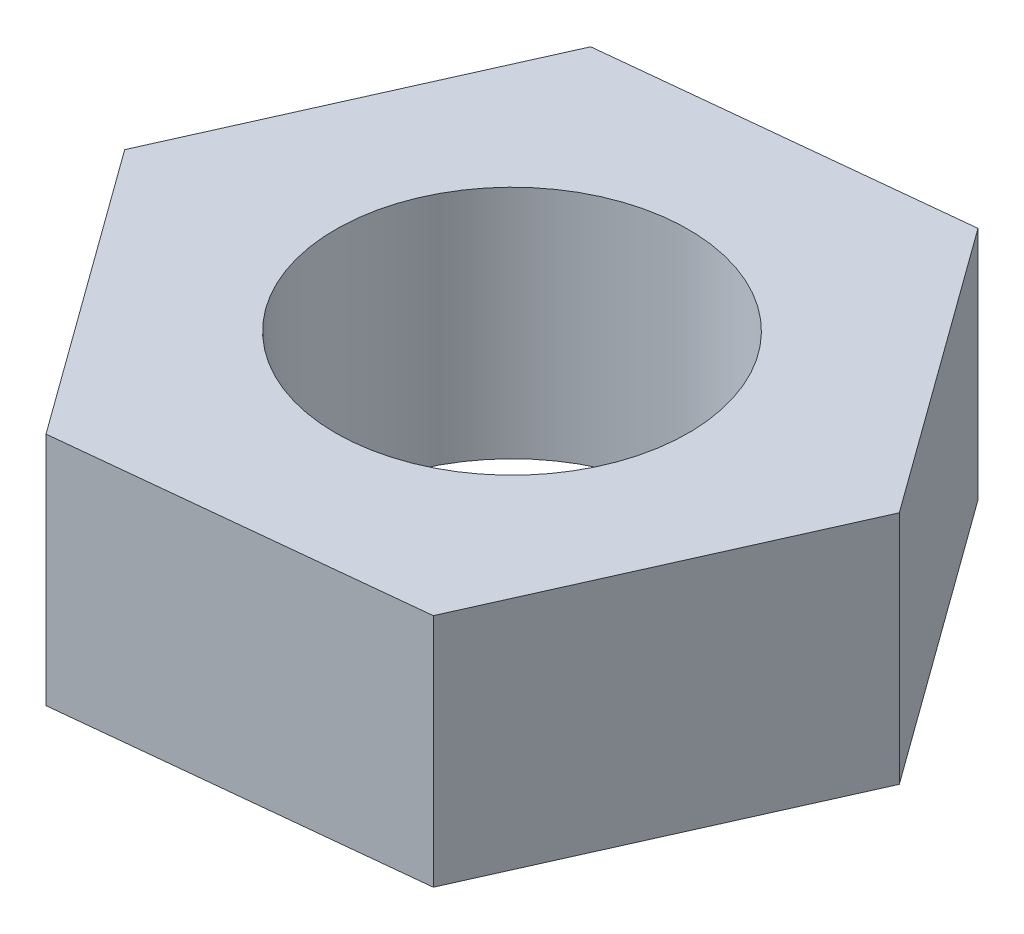
ISO-10303-21;
HEADER;
FILE_DESCRIPTION(('STEP AP214'),'2;1');
FILE_NAME('part.step','',(''),(''),'','','');
FILE_SCHEMA(('AUTOMOTIVE_DESIGN { 1 0 10303 214 1 1 1 1 }'));
ENDSEC;
DATA;
#1=APPLICATION_CONTEXT('core data for automotive mechanical design processes');
#2=APPLICATION_PROTOCOL_DEFINITION('international standard','automotive_design',2000,#1);
#3=PRODUCT_CONTEXT('',#1,'mechanical');
#4=PRODUCT('Part','Part','',(#3));
#5=PRODUCT_RELATED_PRODUCT_CATEGORY('part','',(#4));
#6=PRODUCT_DEFINITION_FORMATION('','',#4);
#7=PRODUCT_DEFINITION_CONTEXT('part definition',#1,'design');
#8=PRODUCT_DEFINITION('design','',#6,#7);
#9=PRODUCT_DEFINITION_SHAPE('','',#8);
#10=(LENGTH_UNIT() NAMED_UNIT(*) SI_UNIT(.MILLI.,.METRE.));
#11=(NAMED_UNIT(*) PLANE_ANGLE_UNIT() SI_UNIT($,.RADIAN.));
#12=(NAMED_UNIT(*) SI_UNIT($,.STERADIAN.) SOLID_ANGLE_UNIT());
#13=UNCERTAINTY_MEASURE_WITH_UNIT(LENGTH_MEASURE(1.E-05),#10,'distance_accuracy_value','');
#14=(GEOMETRIC_REPRESENTATION_CONTEXT(3) GLOBAL_UNCERTAINTY_ASSIGNED_CONTEXT((#13)) GLOBAL_UNIT_ASSIGNED_CONTEXT((#10,
#11,#12)) REPRESENTATION_CONTEXT('',''));
#15=CARTESIAN_POINT('',(0.,0.,0.));
#16=DIRECTION('',(0.,0.,1.));
#17=DIRECTION('',(1.,0.,0.));
#18=AXIS2_PLACEMENT_3D('',#15,#16,#17);
#19=CARTESIAN_POINT('',(-5.39156409330923,2.,-4.14920426860483));
#20=DIRECTION('',(0.,1.,0.));
#21=DIRECTION('',(0.,0.,1.));
#22=AXIS2_PLACEMENT_3D('',#19,#20,#21);
#23=PLANE('',#22);
#24=DIRECTION('',(-0.586718706174764,0.,-0.809790812385897));
#25=VECTOR('',#24,1.);
#26=CARTESIAN_POINT('',(-3.63140797478494,2.,-1.71983183144714));
#27=LINE('',#26,#25);
#28=CARTESIAN_POINT('',(-3.63140797478494,2.,-1.71983183144714));
#29=VERTEX_POINT('',#28);
#30=CARTESIAN_POINT('',(-5.39156409330923,2.,-4.14920426860483));
#31=VERTEX_POINT('',#30);
#32=EDGE_CURVE('E127',#29,#31,#27,.T.);
#33=ORIENTED_EDGE('',*,*,#32,.T.);
#34=DIRECTION('',(-0.994658768364807,0.,0.103217898229934));
#35=VECTOR('',#34,1.);
#36=CARTESIAN_POINT('',(-5.39156409330923,2.,-4.14920426860483));
#37=LINE('',#36,#35);
#38=CARTESIAN_POINT('',(-8.37554039840365,2.,-3.83955057391503));
#39=VERTEX_POINT('',#38);
#40=EDGE_CURVE('E85',#31,#39,#37,.T.);
#41=ORIENTED_EDGE('',*,*,#40,.T.);
#42=DIRECTION('',(-0.407940062190043,0.,0.913008710615832));
#43=VECTOR('',#42,1.);
#44=CARTESIAN_POINT('',(-8.37554039840365,2.,-3.83955057391503));
#45=LINE('',#44,#43);
#46=CARTESIAN_POINT('',(-9.59936058497378,2.,-1.10052444206754));
#47=VERTEX_POINT('',#46);
#48=EDGE_CURVE('E98',#39,#47,#45,.T.);
#49=ORIENTED_EDGE('',*,*,#48,.T.);
#50=DIRECTION('',(0.586718706174763,0.,0.809790812385898));
#51=VECTOR('',#50,1.);
#52=CARTESIAN_POINT('',(-9.59936058497378,2.,-1.10052444206754));
#53=LINE('',#52,#51);
#54=CARTESIAN_POINT('',(-7.83920446644949,2.,1.32884799509016));
#55=VERTEX_POINT('',#54);
#56=EDGE_CURVE('E92',#47,#55,#53,.T.);
#57=ORIENTED_EDGE('',*,*,#56,.T.);
#58=DIRECTION('',(0.994658768364807,0.,-0.103217898229934));
#59=VECTOR('',#58,1.);
#60=CARTESIAN_POINT('',(-7.83920446644949,2.,1.32884799509016));
#61=LINE('',#60,#59);
#62=CARTESIAN_POINT('',(-4.85522816135507,2.,1.01919430040036));
#63=VERTEX_POINT('',#62);
#64=EDGE_CURVE('E96',#55,#63,#61,.T.);
#65=ORIENTED_EDGE('',*,*,#64,.T.);
#66=DIRECTION('',(0.407940062190043,0.,-0.913008710615832));
#67=VECTOR('',#66,1.);
#68=CARTESIAN_POINT('',(-4.85522816135507,2.,1.01919430040036));
#69=LINE('',#68,#67);
#70=EDGE_CURVE('E48',#63,#29,#69,.T.);
#71=ORIENTED_EDGE('',*,*,#70,.T.);
#72=EDGE_LOOP('',(#33,#41,#49,#57,#65,#71));
#73=FACE_BOUND('',#72,.T.);
#74=CARTESIAN_POINT('',(-6.61538427987936,2.,-1.41017813675734));
#75=DIRECTION('',(0.,1.,0.));
#76=DIRECTION('',(0.,0.,1.));
#77=AXIS2_PLACEMENT_3D('',#74,#75,#76);
#78=CIRCLE('',#77,1.5);
#79=CARTESIAN_POINT('',(-6.61538427987936,2.,0.0898218632426591));
#80=VERTEX_POINT('',#79);
#81=EDGE_CURVE('E120',#80,#80,#78,.T.);
#82=ORIENTED_EDGE('',*,*,#81,.F.);
#83=EDGE_LOOP('',(#82));
#84=FACE_BOUND('',#83,.T.);
#85=ADVANCED_FACE('F31',(#73,#84),#23,.T.);
#86=CARTESIAN_POINT('',(-5.39156409330923,0.,-4.14920426860483));
#87=DIRECTION('',(0.,1.,0.));
#88=DIRECTION('',(0.,0.,1.));
#89=AXIS2_PLACEMENT_3D('',#86,#87,#88);
#90=PLANE('',#89);
#91=DIRECTION('',(-0.586718706174764,0.,-0.809790812385897));
#92=VECTOR('',#91,1.);
#93=CARTESIAN_POINT('',(-3.63140797478494,0.,-1.71983183144714));
#94=LINE('',#93,#92);
#95=CARTESIAN_POINT('',(-3.63140797478494,0.,-1.71983183144714));
#96=VERTEX_POINT('',#95);
#97=CARTESIAN_POINT('',(-5.39156409330923,0.,-4.14920426860483));
#98=VERTEX_POINT('',#97);
#99=EDGE_CURVE('E116',#96,#98,#94,.T.);
#100=ORIENTED_EDGE('',*,*,#99,.F.);
#101=DIRECTION('',(0.407940062190043,0.,-0.913008710615832));
#102=VECTOR('',#101,1.);
#103=CARTESIAN_POINT('',(-4.85522816135507,0.,1.01919430040036));
#104=LINE('',#103,#102);
#105=CARTESIAN_POINT('',(-4.85522816135507,0.,1.01919430040036));
#106=VERTEX_POINT('',#105);
#107=EDGE_CURVE('E77',#106,#96,#104,.T.);
#108=ORIENTED_EDGE('',*,*,#107,.F.);
#109=DIRECTION('',(0.994658768364807,0.,-0.103217898229934));
#110=VECTOR('',#109,1.);
#111=CARTESIAN_POINT('',(-7.83920446644949,0.,1.32884799509016));
#112=LINE('',#111,#110);
#113=CARTESIAN_POINT('',(-7.83920446644949,0.,1.32884799509016));
#114=VERTEX_POINT('',#113);
#115=EDGE_CURVE('E71',#114,#106,#112,.T.);
#116=ORIENTED_EDGE('',*,*,#115,.F.);
#117=DIRECTION('',(0.586718706174763,0.,0.809790812385898));
#118=VECTOR('',#117,1.);
#119=CARTESIAN_POINT('',(-9.59936058497378,0.,-1.10052444206754));
#120=LINE('',#119,#118);
#121=CARTESIAN_POINT('',(-9.59936058497378,0.,-1.10052444206754));
#122=VERTEX_POINT('',#121);
#123=EDGE_CURVE('E106',#122,#114,#120,.T.);
#124=ORIENTED_EDGE('',*,*,#123,.F.);
#125=DIRECTION('',(-0.407940062190043,0.,0.913008710615832));
#126=VECTOR('',#125,1.);
#127=CARTESIAN_POINT('',(-8.37554039840365,0.,-3.83955057391503));
#128=LINE('',#127,#126);
#129=CARTESIAN_POINT('',(-8.37554039840365,0.,-3.83955057391503));
#130=VERTEX_POINT('',#129);
#131=EDGE_CURVE('E122',#130,#122,#128,.T.);
#132=ORIENTED_EDGE('',*,*,#131,.F.);
#133=DIRECTION('',(-0.994658768364807,0.,0.103217898229934));
#134=VECTOR('',#133,1.);
#135=CARTESIAN_POINT('',(-5.39156409330923,0.,-4.14920426860483));
#136=LINE('',#135,#134);
#137=EDGE_CURVE('E119',#98,#130,#136,.T.);
#138=ORIENTED_EDGE('',*,*,#137,.F.);
#139=EDGE_LOOP('',(#100,#108,#116,#124,#132,#138));
#140=FACE_BOUND('',#139,.T.);
#141=CARTESIAN_POINT('',(-6.61538427987936,0.,-1.41017813675734));
#142=DIRECTION('',(0.,1.,0.));
#143=DIRECTION('',(0.,0.,1.));
#144=AXIS2_PLACEMENT_3D('',#141,#142,#143);
#145=CIRCLE('',#144,1.5);
#146=CARTESIAN_POINT('',(-6.61538427987936,0.,0.0898218632426591));
#147=VERTEX_POINT('',#146);
#148=EDGE_CURVE('E220',#147,#147,#145,.T.);
#149=ORIENTED_EDGE('',*,*,#148,.T.);
#150=EDGE_LOOP('',(#149));
#151=FACE_BOUND('',#150,.T.);
#152=ADVANCED_FACE('F136',(#140,#151),#90,.F.);
#153=CARTESIAN_POINT('',(-3.63140797478494,2.,-1.71983183144714));
#154=DIRECTION('',(-0.809790812385897,0.,0.586718706174764));
#155=DIRECTION('',(0.586718706174764,0.,0.809790812385897));
#156=AXIS2_PLACEMENT_3D('',#153,#154,#155);
#157=PLANE('',#156);
#158=ORIENTED_EDGE('',*,*,#99,.T.);
#159=DIRECTION('',(0.,-1.,0.));
#160=VECTOR('',#159,1.);
#161=CARTESIAN_POINT('',(-5.39156409330923,2.,-4.14920426860483));
#162=LINE('',#161,#160);
#163=EDGE_CURVE('E11',#31,#98,#162,.T.);
#164=ORIENTED_EDGE('',*,*,#163,.F.);
#165=ORIENTED_EDGE('',*,*,#32,.F.);
#166=DIRECTION('',(0.,-1.,0.));
#167=VECTOR('',#166,1.);
#168=CARTESIAN_POINT('',(-3.63140797478494,2.,-1.71983183144714));
#169=LINE('',#168,#167);
#170=EDGE_CURVE('E112',#29,#96,#169,.T.);
#171=ORIENTED_EDGE('',*,*,#170,.T.);
#172=EDGE_LOOP('',(#158,#164,#165,#171));
#173=FACE_BOUND('',#172,.T.);
#174=ADVANCED_FACE('F33',(#173),#157,.F.);
#175=CARTESIAN_POINT('',(-5.39156409330923,2.,-4.14920426860483));
#176=DIRECTION('',(0.103217898229934,0.,0.994658768364807));
#177=DIRECTION('',(0.994658768364807,0.,-0.103217898229934));
#178=AXIS2_PLACEMENT_3D('',#175,#176,#177);
#179=PLANE('',#178);
#180=ORIENTED_EDGE('',*,*,#137,.T.);
#181=DIRECTION('',(0.,-1.,0.));
#182=VECTOR('',#181,1.);
#183=CARTESIAN_POINT('',(-8.37554039840365,2.,-3.83955057391503));
#184=LINE('',#183,#182);
#185=EDGE_CURVE('E40',#39,#130,#184,.T.);
#186=ORIENTED_EDGE('',*,*,#185,.F.);
#187=ORIENTED_EDGE('',*,*,#40,.F.);
#188=ORIENTED_EDGE('',*,*,#163,.T.);
#189=EDGE_LOOP('',(#180,#186,#187,#188));
#190=FACE_BOUND('',#189,.T.);
#191=ADVANCED_FACE('F161',(#190),#179,.F.);
#192=CARTESIAN_POINT('',(-8.37554039840365,2.,-3.83955057391503));
#193=DIRECTION('',(0.913008710615832,0.,0.407940062190043));
#194=DIRECTION('',(0.407940062190043,0.,-0.913008710615832));
#195=AXIS2_PLACEMENT_3D('',#192,#193,#194);
#196=PLANE('',#195);
#197=ORIENTED_EDGE('',*,*,#131,.T.);
#198=DIRECTION('',(0.,-1.,0.));
#199=VECTOR('',#198,1.);
#200=CARTESIAN_POINT('',(-9.59936058497378,2.,-1.10052444206754));
#201=LINE('',#200,#199);
#202=EDGE_CURVE('E107',#47,#122,#201,.T.);
#203=ORIENTED_EDGE('',*,*,#202,.F.);
#204=ORIENTED_EDGE('',*,*,#48,.F.);
#205=ORIENTED_EDGE('',*,*,#185,.T.);
#206=EDGE_LOOP('',(#197,#203,#204,#205));
#207=FACE_BOUND('',#206,.T.);
#208=ADVANCED_FACE('F133',(#207),#196,.F.);
#209=CARTESIAN_POINT('',(-9.59936058497378,2.,-1.10052444206754));
#210=DIRECTION('',(0.809790812385898,0.,-0.586718706174763));
#211=DIRECTION('',(-0.586718706174763,0.,-0.809790812385898));
#212=AXIS2_PLACEMENT_3D('',#209,#210,#211);
#213=PLANE('',#212);
#214=ORIENTED_EDGE('',*,*,#123,.T.);
#215=DIRECTION('',(0.,-1.,0.));
#216=VECTOR('',#215,1.);
#217=CARTESIAN_POINT('',(-7.83920446644949,2.,1.32884799509016));
#218=LINE('',#217,#216);
#219=EDGE_CURVE('E103',#55,#114,#218,.T.);
#220=ORIENTED_EDGE('',*,*,#219,.F.);
#221=ORIENTED_EDGE('',*,*,#56,.F.);
#222=ORIENTED_EDGE('',*,*,#202,.T.);
#223=EDGE_LOOP('',(#214,#220,#221,#222));
#224=FACE_BOUND('',#223,.T.);
#225=ADVANCED_FACE('F104',(#224),#213,.F.);
#226=CARTESIAN_POINT('',(-7.83920446644949,2.,1.32884799509016));
#227=DIRECTION('',(-0.103217898229934,0.,-0.994658768364807));
#228=DIRECTION('',(-0.994658768364807,0.,0.103217898229934));
#229=AXIS2_PLACEMENT_3D('',#226,#227,#228);
#230=PLANE('',#229);
#231=ORIENTED_EDGE('',*,*,#115,.T.);
#232=DIRECTION('',(0.,-1.,0.));
#233=VECTOR('',#232,1.);
#234=CARTESIAN_POINT('',(-4.85522816135507,2.,1.01919430040036));
#235=LINE('',#234,#233);
#236=EDGE_CURVE('E108',#63,#106,#235,.T.);
#237=ORIENTED_EDGE('',*,*,#236,.F.);
#238=ORIENTED_EDGE('',*,*,#64,.F.);
#239=ORIENTED_EDGE('',*,*,#219,.T.);
#240=EDGE_LOOP('',(#231,#237,#238,#239));
#241=FACE_BOUND('',#240,.T.);
#242=ADVANCED_FACE('F110',(#241),#230,.F.);
#243=CARTESIAN_POINT('',(-4.85522816135507,2.,1.01919430040036));
#244=DIRECTION('',(-0.913008710615832,0.,-0.407940062190043));
#245=DIRECTION('',(-0.407940062190043,0.,0.913008710615832));
#246=AXIS2_PLACEMENT_3D('',#243,#244,#245);
#247=PLANE('',#246);
#248=ORIENTED_EDGE('',*,*,#107,.T.);
#249=ORIENTED_EDGE('',*,*,#170,.F.);
#250=ORIENTED_EDGE('',*,*,#70,.F.);
#251=ORIENTED_EDGE('',*,*,#236,.T.);
#252=EDGE_LOOP('',(#248,#249,#250,#251));
#253=FACE_BOUND('',#252,.T.);
#254=ADVANCED_FACE('F141',(#253),#247,.F.);
#255=CARTESIAN_POINT('',(-6.61538427987936,2.,-1.41017813675734));
#256=DIRECTION('',(0.,-1.,0.));
#257=DIRECTION('',(0.,0.,-1.));
#258=AXIS2_PLACEMENT_3D('',#255,#256,#257);
#259=CYLINDRICAL_SURFACE('',#258,1.5);
#260=ORIENTED_EDGE('',*,*,#81,.T.);
#261=EDGE_LOOP('',(#260));
#262=FACE_BOUND('',#261,.T.);
#263=ORIENTED_EDGE('',*,*,#148,.F.);
#264=EDGE_LOOP('',(#263));
#265=FACE_BOUND('',#264,.T.);
#266=ADVANCED_FACE('F143',(#262,#265),#259,.F.);
#267=CLOSED_SHELL('',(#85,#152,#174,#191,#208,#225,#242,#254,#266));
#268=MANIFOLD_SOLID_BREP('B2',#267);
#269=ADVANCED_BREP_SHAPE_REPRESENTATION('',(#18,#268),#14);
#270=SHAPE_DEFINITION_REPRESENTATION(#9,#269);
ENDSEC;
END-ISO-10303-21;
